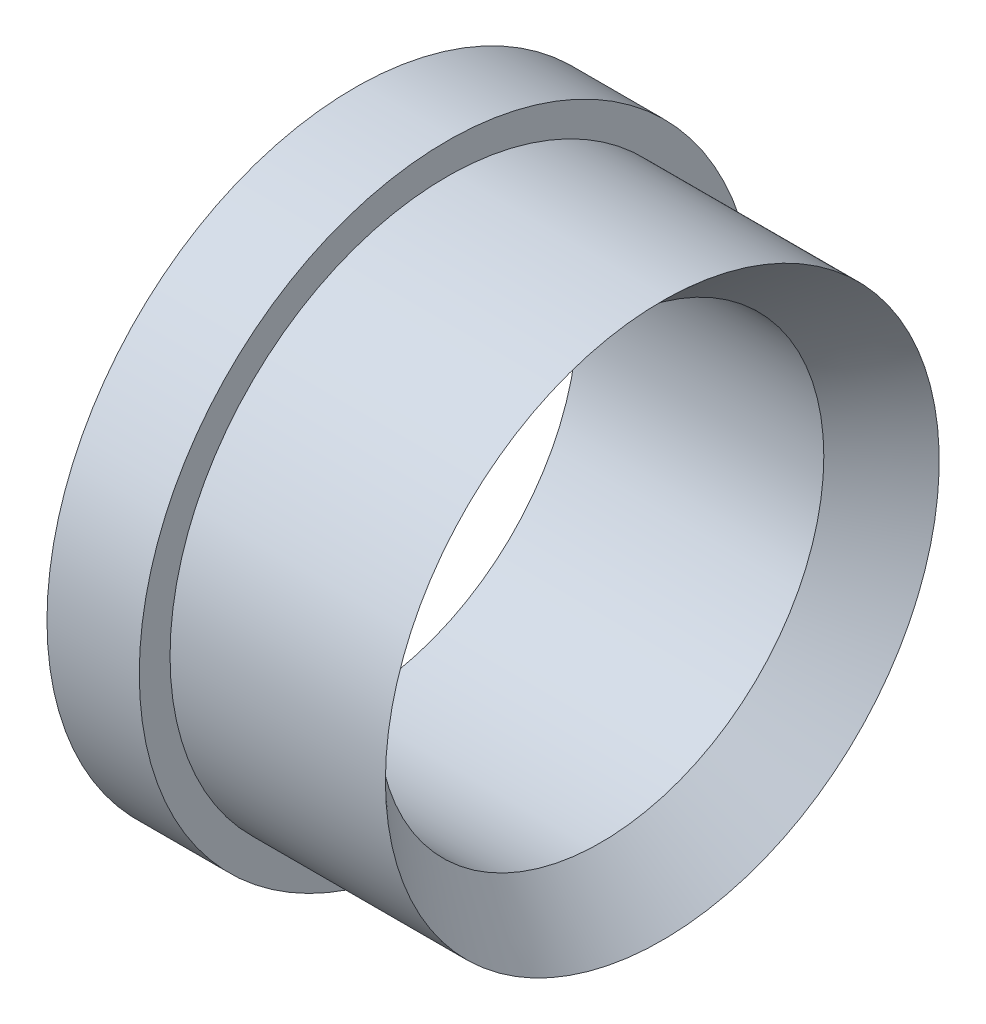
ISO-10303-21;
HEADER;
FILE_DESCRIPTION(('STEP AP214'),'2;1');
FILE_NAME('part.step','',(''),(''),'','','');
FILE_SCHEMA(('AUTOMOTIVE_DESIGN { 1 0 10303 214 1 1 1 1 }'));
ENDSEC;
DATA;
#1=APPLICATION_CONTEXT('core data for automotive mechanical design processes');
#2=APPLICATION_PROTOCOL_DEFINITION('international standard','automotive_design',2000,#1);
#3=PRODUCT_CONTEXT('',#1,'mechanical');
#4=PRODUCT('Part','Part','',(#3));
#5=PRODUCT_RELATED_PRODUCT_CATEGORY('part','',(#4));
#6=PRODUCT_DEFINITION_FORMATION('','',#4);
#7=PRODUCT_DEFINITION_CONTEXT('part definition',#1,'design');
#8=PRODUCT_DEFINITION('design','',#6,#7);
#9=PRODUCT_DEFINITION_SHAPE('','',#8);
#10=(LENGTH_UNIT() NAMED_UNIT(*) SI_UNIT(.MILLI.,.METRE.));
#11=(NAMED_UNIT(*) PLANE_ANGLE_UNIT() SI_UNIT($,.RADIAN.));
#12=(NAMED_UNIT(*) SI_UNIT($,.STERADIAN.) SOLID_ANGLE_UNIT());
#13=UNCERTAINTY_MEASURE_WITH_UNIT(LENGTH_MEASURE(1.E-05),#10,'distance_accuracy_value','');
#14=(GEOMETRIC_REPRESENTATION_CONTEXT(3) GLOBAL_UNCERTAINTY_ASSIGNED_CONTEXT((#13)) GLOBAL_UNIT_ASSIGNED_CONTEXT((#10,
#11,#12)) REPRESENTATION_CONTEXT('',''));
#15=CARTESIAN_POINT('',(0.,0.,0.));
#16=DIRECTION('',(0.,0.,1.));
#17=DIRECTION('',(1.,0.,0.));
#18=AXIS2_PLACEMENT_3D('',#15,#16,#17);
#19=CARTESIAN_POINT('',(8.,0.,0.));
#20=DIRECTION('',(1.,0.,0.));
#21=DIRECTION('',(0.,0.,-1.));
#22=AXIS2_PLACEMENT_3D('',#19,#20,#21);
#23=CONICAL_SURFACE('',#22,7.25,0.718829999621624);
#24=CARTESIAN_POINT('',(10.,0.,0.));
#25=DIRECTION('',(-1.,0.,0.));
#26=DIRECTION('',(0.,0.,1.));
#27=AXIS2_PLACEMENT_3D('',#24,#25,#26);
#28=CIRCLE('',#27,9.);
#29=CARTESIAN_POINT('',(10.,0.,9.));
#30=VERTEX_POINT('',#29);
#31=EDGE_CURVE('E57',#30,#30,#28,.T.);
#32=ORIENTED_EDGE('',*,*,#31,.F.);
#33=EDGE_LOOP('',(#32));
#34=FACE_BOUND('',#33,.T.);
#35=CARTESIAN_POINT('',(8.,0.,0.));
#36=DIRECTION('',(-1.,0.,0.));
#37=DIRECTION('',(0.,0.,1.));
#38=AXIS2_PLACEMENT_3D('',#35,#36,#37);
#39=CIRCLE('',#38,7.25);
#40=CARTESIAN_POINT('',(8.,0.,7.25));
#41=VERTEX_POINT('',#40);
#42=EDGE_CURVE('E10',#41,#41,#39,.T.);
#43=ORIENTED_EDGE('',*,*,#42,.T.);
#44=EDGE_LOOP('',(#43));
#45=FACE_BOUND('',#44,.T.);
#46=ADVANCED_FACE('F35',(#34,#45),#23,.F.);
#47=CARTESIAN_POINT('',(0.,0.,0.));
#48=DIRECTION('',(-1.,0.,0.));
#49=DIRECTION('',(0.,0.,1.));
#50=AXIS2_PLACEMENT_3D('',#47,#48,#49);
#51=CYLINDRICAL_SURFACE('',#50,7.25);
#52=ORIENTED_EDGE('',*,*,#42,.F.);
#53=EDGE_LOOP('',(#52));
#54=FACE_BOUND('',#53,.T.);
#55=CARTESIAN_POINT('',(0.,0.,0.));
#56=DIRECTION('',(-1.,0.,0.));
#57=DIRECTION('',(0.,0.,1.));
#58=AXIS2_PLACEMENT_3D('',#55,#56,#57);
#59=CIRCLE('',#58,7.25);
#60=CARTESIAN_POINT('',(0.,0.,7.25));
#61=VERTEX_POINT('',#60);
#62=EDGE_CURVE('E41',#61,#61,#59,.T.);
#63=ORIENTED_EDGE('',*,*,#62,.T.);
#64=EDGE_LOOP('',(#63));
#65=FACE_BOUND('',#64,.T.);
#66=ADVANCED_FACE('F64',(#54,#65),#51,.F.);
#67=CARTESIAN_POINT('',(0.,7.25,0.));
#68=DIRECTION('',(1.,0.,0.));
#69=DIRECTION('',(0.,0.,-1.));
#70=AXIS2_PLACEMENT_3D('',#67,#68,#69);
#71=PLANE('',#70);
#72=ORIENTED_EDGE('',*,*,#62,.F.);
#73=EDGE_LOOP('',(#72));
#74=FACE_BOUND('',#73,.T.);
#75=CARTESIAN_POINT('',(0.,0.,0.));
#76=DIRECTION('',(-1.,0.,0.));
#77=DIRECTION('',(0.,0.,1.));
#78=AXIS2_PLACEMENT_3D('',#75,#76,#77);
#79=CIRCLE('',#78,10.);
#80=CARTESIAN_POINT('',(0.,0.,10.));
#81=VERTEX_POINT('',#80);
#82=EDGE_CURVE('E45',#81,#81,#79,.T.);
#83=ORIENTED_EDGE('',*,*,#82,.T.);
#84=EDGE_LOOP('',(#83));
#85=FACE_BOUND('',#84,.T.);
#86=ADVANCED_FACE('F68',(#74,#85),#71,.F.);
#87=CARTESIAN_POINT('',(0.,0.,0.));
#88=DIRECTION('',(-1.,0.,0.));
#89=DIRECTION('',(0.,0.,1.));
#90=AXIS2_PLACEMENT_3D('',#87,#88,#89);
#91=CYLINDRICAL_SURFACE('',#90,10.);
#92=ORIENTED_EDGE('',*,*,#82,.F.);
#93=EDGE_LOOP('',(#92));
#94=FACE_BOUND('',#93,.T.);
#95=CARTESIAN_POINT('',(3.,0.,0.));
#96=DIRECTION('',(-1.,0.,0.));
#97=DIRECTION('',(0.,0.,1.));
#98=AXIS2_PLACEMENT_3D('',#95,#96,#97);
#99=CIRCLE('',#98,10.);
#100=CARTESIAN_POINT('',(3.,0.,10.));
#101=VERTEX_POINT('',#100);
#102=EDGE_CURVE('E49',#101,#101,#99,.T.);
#103=ORIENTED_EDGE('',*,*,#102,.T.);
#104=EDGE_LOOP('',(#103));
#105=FACE_BOUND('',#104,.T.);
#106=ADVANCED_FACE('F73',(#94,#105),#91,.T.);
#107=CARTESIAN_POINT('',(3.,10.,0.));
#108=DIRECTION('',(-1.,0.,0.));
#109=DIRECTION('',(0.,0.,1.));
#110=AXIS2_PLACEMENT_3D('',#107,#108,#109);
#111=PLANE('',#110);
#112=ORIENTED_EDGE('',*,*,#102,.F.);
#113=EDGE_LOOP('',(#112));
#114=FACE_BOUND('',#113,.T.);
#115=CARTESIAN_POINT('',(3.,0.,0.));
#116=DIRECTION('',(-1.,0.,0.));
#117=DIRECTION('',(0.,0.,1.));
#118=AXIS2_PLACEMENT_3D('',#115,#116,#117);
#119=CIRCLE('',#118,9.);
#120=CARTESIAN_POINT('',(3.,0.,9.));
#121=VERTEX_POINT('',#120);
#122=EDGE_CURVE('E54',#121,#121,#119,.T.);
#123=ORIENTED_EDGE('',*,*,#122,.T.);
#124=EDGE_LOOP('',(#123));
#125=FACE_BOUND('',#124,.T.);
#126=ADVANCED_FACE('F79',(#114,#125),#111,.F.);
#127=CARTESIAN_POINT('',(0.,0.,0.));
#128=DIRECTION('',(-1.,0.,0.));
#129=DIRECTION('',(0.,0.,1.));
#130=AXIS2_PLACEMENT_3D('',#127,#128,#129);
#131=CYLINDRICAL_SURFACE('',#130,9.);
#132=ORIENTED_EDGE('',*,*,#122,.F.);
#133=EDGE_LOOP('',(#132));
#134=FACE_BOUND('',#133,.T.);
#135=ORIENTED_EDGE('',*,*,#31,.T.);
#136=EDGE_LOOP('',(#135));
#137=FACE_BOUND('',#136,.T.);
#138=ADVANCED_FACE('F61',(#134,#137),#131,.T.);
#139=CLOSED_SHELL('',(#46,#66,#86,#106,#126,#138));
#140=MANIFOLD_SOLID_BREP('B2',#139);
#141=ADVANCED_BREP_SHAPE_REPRESENTATION('',(#18,#140),#14);
#142=SHAPE_DEFINITION_REPRESENTATION(#9,#141);
ENDSEC;
END-ISO-10303-21;
